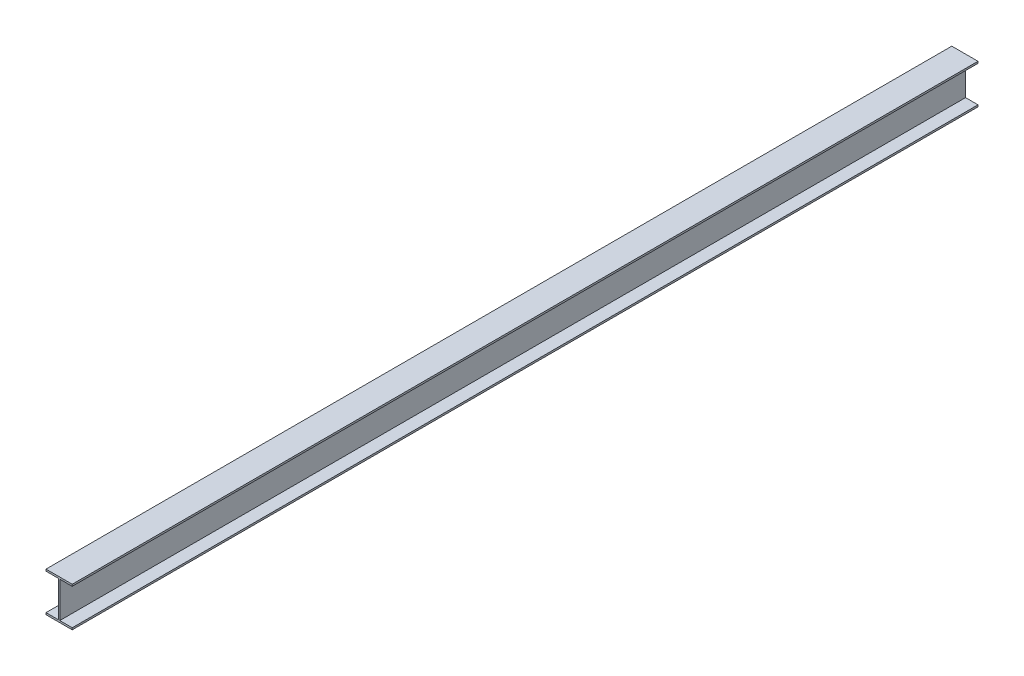
ISO-10303-21;
HEADER;
FILE_DESCRIPTION(('STEP AP214'),'2;1');
FILE_NAME('part.step','',(''),(''),'','','');
FILE_SCHEMA(('AUTOMOTIVE_DESIGN { 1 0 10303 214 1 1 1 1 }'));
ENDSEC;
DATA;
#1=APPLICATION_CONTEXT('core data for automotive mechanical design processes');
#2=APPLICATION_PROTOCOL_DEFINITION('international standard','automotive_design',2000,#1);
#3=PRODUCT_CONTEXT('',#1,'mechanical');
#4=PRODUCT('Part','Part','',(#3));
#5=PRODUCT_RELATED_PRODUCT_CATEGORY('part','',(#4));
#6=PRODUCT_DEFINITION_FORMATION('','',#4);
#7=PRODUCT_DEFINITION_CONTEXT('part definition',#1,'design');
#8=PRODUCT_DEFINITION('design','',#6,#7);
#9=PRODUCT_DEFINITION_SHAPE('','',#8);
#10=(LENGTH_UNIT() NAMED_UNIT(*) SI_UNIT(.MILLI.,.METRE.));
#11=(NAMED_UNIT(*) PLANE_ANGLE_UNIT() SI_UNIT($,.RADIAN.));
#12=(NAMED_UNIT(*) SI_UNIT($,.STERADIAN.) SOLID_ANGLE_UNIT());
#13=UNCERTAINTY_MEASURE_WITH_UNIT(LENGTH_MEASURE(1.E-05),#10,'distance_accuracy_value','');
#14=(GEOMETRIC_REPRESENTATION_CONTEXT(3) GLOBAL_UNCERTAINTY_ASSIGNED_CONTEXT((#13)) GLOBAL_UNIT_ASSIGNED_CONTEXT((#10,
#11,#12)) REPRESENTATION_CONTEXT('',''));
#15=CARTESIAN_POINT('',(0.,0.,0.));
#16=DIRECTION('',(0.,0.,1.));
#17=DIRECTION('',(1.,0.,0.));
#18=AXIS2_PLACEMENT_3D('',#15,#16,#17);
#19=CARTESIAN_POINT('',(0.,-7.11224053295814,3510.));
#20=DIRECTION('',(1.,0.,0.));
#21=DIRECTION('',(0.,0.,-1.));
#22=AXIS2_PLACEMENT_3D('',#19,#20,#21);
#23=PLANE('',#22);
#24=DIRECTION('',(0.,-1.,0.));
#25=VECTOR('',#24,1.);
#26=CARTESIAN_POINT('',(0.,-7.11224053295814,0.));
#27=LINE('',#26,#25);
#28=CARTESIAN_POINT('',(0.,-0.000240532958142959,0.));
#29=VERTEX_POINT('',#28);
#30=CARTESIAN_POINT('',(0.,-7.11224053295814,0.));
#31=VERTEX_POINT('',#30);
#32=EDGE_CURVE('E152',#29,#31,#27,.T.);
#33=ORIENTED_EDGE('',*,*,#32,.T.);
#34=DIRECTION('',(0.,0.,-1.));
#35=VECTOR('',#34,1.);
#36=CARTESIAN_POINT('',(0.,-7.11224053295814,3510.));
#37=LINE('',#36,#35);
#38=CARTESIAN_POINT('',(0.,-7.11224053295814,3510.));
#39=VERTEX_POINT('',#38);
#40=EDGE_CURVE('E11',#39,#31,#37,.T.);
#41=ORIENTED_EDGE('',*,*,#40,.F.);
#42=DIRECTION('',(0.,-1.,0.));
#43=VECTOR('',#42,1.);
#44=CARTESIAN_POINT('',(0.,-7.11224053295814,3510.));
#45=LINE('',#44,#43);
#46=CARTESIAN_POINT('',(0.,-0.000240532958142959,3510.));
#47=VERTEX_POINT('',#46);
#48=EDGE_CURVE('E174',#47,#39,#45,.T.);
#49=ORIENTED_EDGE('',*,*,#48,.F.);
#50=DIRECTION('',(0.,0.,-1.));
#51=VECTOR('',#50,1.);
#52=CARTESIAN_POINT('',(0.,-0.000240532958142959,3510.));
#53=LINE('',#52,#51);
#54=EDGE_CURVE('E148',#47,#29,#53,.T.);
#55=ORIENTED_EDGE('',*,*,#54,.T.);
#56=EDGE_LOOP('',(#33,#41,#49,#55));
#57=FACE_BOUND('',#56,.T.);
#58=ADVANCED_FACE('F32',(#57),#23,.F.);
#59=CARTESIAN_POINT('',(47.5660357142857,-7.11224053295814,3510.));
#60=DIRECTION('',(0.,1.,0.));
#61=DIRECTION('',(-1.,0.,0.));
#62=AXIS2_PLACEMENT_3D('',#59,#60,#61);
#63=PLANE('',#62);
#64=DIRECTION('',(1.,0.,0.));
#65=VECTOR('',#64,1.);
#66=CARTESIAN_POINT('',(47.5660357142857,-7.11224053295814,0.));
#67=LINE('',#66,#65);
#68=CARTESIAN_POINT('',(47.5660357142857,-7.11224053295814,0.));
#69=VERTEX_POINT('',#68);
#70=EDGE_CURVE('E155',#31,#69,#67,.T.);
#71=ORIENTED_EDGE('',*,*,#70,.T.);
#72=DIRECTION('',(0.,0.,-1.));
#73=VECTOR('',#72,1.);
#74=CARTESIAN_POINT('',(47.5660357142857,-7.11224053295814,3510.));
#75=LINE('',#74,#73);
#76=CARTESIAN_POINT('',(47.5660357142857,-7.11224053295814,3510.));
#77=VERTEX_POINT('',#76);
#78=EDGE_CURVE('E40',#77,#69,#75,.T.);
#79=ORIENTED_EDGE('',*,*,#78,.F.);
#80=DIRECTION('',(1.,0.,0.));
#81=VECTOR('',#80,1.);
#82=CARTESIAN_POINT('',(47.5660357142857,-7.11224053295814,3510.));
#83=LINE('',#82,#81);
#84=EDGE_CURVE('E103',#39,#77,#83,.T.);
#85=ORIENTED_EDGE('',*,*,#84,.F.);
#86=ORIENTED_EDGE('',*,*,#40,.T.);
#87=EDGE_LOOP('',(#71,#79,#85,#86));
#88=FACE_BOUND('',#87,.T.);
#89=ADVANCED_FACE('F252',(#88),#63,.F.);
#90=CARTESIAN_POINT('',(47.5660357142857,-146.050240532958,3510.));
#91=DIRECTION('',(1.,0.,0.));
#92=DIRECTION('',(0.,0.,-1.));
#93=AXIS2_PLACEMENT_3D('',#90,#91,#92);
#94=PLANE('',#93);
#95=DIRECTION('',(0.,-1.,0.));
#96=VECTOR('',#95,1.);
#97=CARTESIAN_POINT('',(47.5660357142857,-146.050240532958,0.));
#98=LINE('',#97,#96);
#99=CARTESIAN_POINT('',(47.5660357142857,-146.050240532958,0.));
#100=VERTEX_POINT('',#99);
#101=EDGE_CURVE('E157',#69,#100,#98,.T.);
#102=ORIENTED_EDGE('',*,*,#101,.T.);
#103=DIRECTION('',(0.,0.,-1.));
#104=VECTOR('',#103,1.);
#105=CARTESIAN_POINT('',(47.5660357142857,-146.050240532958,3510.));
#106=LINE('',#105,#104);
#107=CARTESIAN_POINT('',(47.5660357142857,-146.050240532958,3510.));
#108=VERTEX_POINT('',#107);
#109=EDGE_CURVE('E193',#108,#100,#106,.T.);
#110=ORIENTED_EDGE('',*,*,#109,.F.);
#111=DIRECTION('',(0.,-1.,0.));
#112=VECTOR('',#111,1.);
#113=CARTESIAN_POINT('',(47.5660357142857,-146.050240532958,3510.));
#114=LINE('',#113,#112);
#115=EDGE_CURVE('E201',#77,#108,#114,.T.);
#116=ORIENTED_EDGE('',*,*,#115,.F.);
#117=ORIENTED_EDGE('',*,*,#78,.T.);
#118=EDGE_LOOP('',(#102,#110,#116,#117));
#119=FACE_BOUND('',#118,.T.);
#120=ADVANCED_FACE('F199',(#119),#94,.F.);
#121=CARTESIAN_POINT('',(0.,-146.050240532958,3510.));
#122=DIRECTION('',(0.,-1.,0.));
#123=DIRECTION('',(1.,0.,0.));
#124=AXIS2_PLACEMENT_3D('',#121,#122,#123);
#125=PLANE('',#124);
#126=DIRECTION('',(-1.,0.,0.));
#127=VECTOR('',#126,1.);
#128=CARTESIAN_POINT('',(0.,-146.050240532958,0.));
#129=LINE('',#128,#127);
#130=CARTESIAN_POINT('',(0.,-146.050240532958,0.));
#131=VERTEX_POINT('',#130);
#132=EDGE_CURVE('E159',#100,#131,#129,.T.);
#133=ORIENTED_EDGE('',*,*,#132,.T.);
#134=DIRECTION('',(0.,0.,-1.));
#135=VECTOR('',#134,1.);
#136=CARTESIAN_POINT('',(0.,-146.050240532958,3510.));
#137=LINE('',#136,#135);
#138=CARTESIAN_POINT('',(0.,-146.050240532958,3510.));
#139=VERTEX_POINT('',#138);
#140=EDGE_CURVE('E190',#139,#131,#137,.T.);
#141=ORIENTED_EDGE('',*,*,#140,.F.);
#142=DIRECTION('',(-1.,0.,0.));
#143=VECTOR('',#142,1.);
#144=CARTESIAN_POINT('',(0.,-146.050240532958,3510.));
#145=LINE('',#144,#143);
#146=EDGE_CURVE('E219',#108,#139,#145,.T.);
#147=ORIENTED_EDGE('',*,*,#146,.F.);
#148=ORIENTED_EDGE('',*,*,#109,.T.);
#149=EDGE_LOOP('',(#133,#141,#147,#148));
#150=FACE_BOUND('',#149,.T.);
#151=ADVANCED_FACE('F210',(#150),#125,.F.);
#152=CARTESIAN_POINT('',(0.,-153.162240532958,3510.));
#153=DIRECTION('',(1.,0.,0.));
#154=DIRECTION('',(0.,0.,-1.));
#155=AXIS2_PLACEMENT_3D('',#152,#153,#154);
#156=PLANE('',#155);
#157=DIRECTION('',(0.,-1.,0.));
#158=VECTOR('',#157,1.);
#159=CARTESIAN_POINT('',(0.,-153.162240532958,0.));
#160=LINE('',#159,#158);
#161=CARTESIAN_POINT('',(0.,-153.162240532958,0.));
#162=VERTEX_POINT('',#161);
#163=EDGE_CURVE('E161',#131,#162,#160,.T.);
#164=ORIENTED_EDGE('',*,*,#163,.T.);
#165=DIRECTION('',(0.,0.,-1.));
#166=VECTOR('',#165,1.);
#167=CARTESIAN_POINT('',(0.,-153.162240532958,3510.));
#168=LINE('',#167,#166);
#169=CARTESIAN_POINT('',(0.,-153.162240532958,3510.));
#170=VERTEX_POINT('',#169);
#171=EDGE_CURVE('E187',#170,#162,#168,.T.);
#172=ORIENTED_EDGE('',*,*,#171,.F.);
#173=DIRECTION('',(0.,-1.,0.));
#174=VECTOR('',#173,1.);
#175=CARTESIAN_POINT('',(0.,-153.162240532958,3510.));
#176=LINE('',#175,#174);
#177=EDGE_CURVE('E216',#139,#170,#176,.T.);
#178=ORIENTED_EDGE('',*,*,#177,.F.);
#179=ORIENTED_EDGE('',*,*,#140,.T.);
#180=EDGE_LOOP('',(#164,#172,#178,#179));
#181=FACE_BOUND('',#180,.T.);
#182=ADVANCED_FACE('F214',(#181),#156,.F.);
#183=CARTESIAN_POINT('',(101.6,-153.162240532958,3510.));
#184=DIRECTION('',(0.,1.,0.));
#185=DIRECTION('',(0.,0.,1.));
#186=AXIS2_PLACEMENT_3D('',#183,#184,#185);
#187=PLANE('',#186);
#188=DIRECTION('',(1.,0.,0.));
#189=VECTOR('',#188,1.);
#190=CARTESIAN_POINT('',(101.6,-153.162240532958,0.));
#191=LINE('',#190,#189);
#192=CARTESIAN_POINT('',(101.6,-153.162240532958,0.));
#193=VERTEX_POINT('',#192);
#194=EDGE_CURVE('E163',#162,#193,#191,.T.);
#195=ORIENTED_EDGE('',*,*,#194,.T.);
#196=DIRECTION('',(0.,0.,-1.));
#197=VECTOR('',#196,1.);
#198=CARTESIAN_POINT('',(101.6,-153.162240532958,3510.));
#199=LINE('',#198,#197);
#200=CARTESIAN_POINT('',(101.6,-153.162240532958,3510.));
#201=VERTEX_POINT('',#200);
#202=EDGE_CURVE('E184',#201,#193,#199,.T.);
#203=ORIENTED_EDGE('',*,*,#202,.F.);
#204=DIRECTION('',(1.,0.,0.));
#205=VECTOR('',#204,1.);
#206=CARTESIAN_POINT('',(101.6,-153.162240532958,3510.));
#207=LINE('',#206,#205);
#208=EDGE_CURVE('E218',#170,#201,#207,.T.);
#209=ORIENTED_EDGE('',*,*,#208,.F.);
#210=ORIENTED_EDGE('',*,*,#171,.T.);
#211=EDGE_LOOP('',(#195,#203,#209,#210));
#212=FACE_BOUND('',#211,.T.);
#213=ADVANCED_FACE('F265',(#212),#187,.F.);
#214=CARTESIAN_POINT('',(101.6,-146.050240532958,3510.));
#215=DIRECTION('',(-1.,0.,0.));
#216=DIRECTION('',(0.,0.,1.));
#217=AXIS2_PLACEMENT_3D('',#214,#215,#216);
#218=PLANE('',#217);
#219=DIRECTION('',(0.,1.,0.));
#220=VECTOR('',#219,1.);
#221=CARTESIAN_POINT('',(101.6,-146.050240532958,0.));
#222=LINE('',#221,#220);
#223=CARTESIAN_POINT('',(101.6,-146.050240532958,0.));
#224=VERTEX_POINT('',#223);
#225=EDGE_CURVE('E165',#193,#224,#222,.T.);
#226=ORIENTED_EDGE('',*,*,#225,.T.);
#227=DIRECTION('',(0.,0.,-1.));
#228=VECTOR('',#227,1.);
#229=CARTESIAN_POINT('',(101.6,-146.050240532958,3510.));
#230=LINE('',#229,#228);
#231=CARTESIAN_POINT('',(101.6,-146.050240532958,3510.));
#232=VERTEX_POINT('',#231);
#233=EDGE_CURVE('E181',#232,#224,#230,.T.);
#234=ORIENTED_EDGE('',*,*,#233,.F.);
#235=DIRECTION('',(0.,1.,0.));
#236=VECTOR('',#235,1.);
#237=CARTESIAN_POINT('',(101.6,-146.050240532958,3510.));
#238=LINE('',#237,#236);
#239=EDGE_CURVE('E221',#201,#232,#238,.T.);
#240=ORIENTED_EDGE('',*,*,#239,.F.);
#241=ORIENTED_EDGE('',*,*,#202,.T.);
#242=EDGE_LOOP('',(#226,#234,#240,#241));
#243=FACE_BOUND('',#242,.T.);
#244=ADVANCED_FACE('F268',(#243),#218,.F.);
#245=CARTESIAN_POINT('',(53.4080357142857,-146.050240532958,3510.));
#246=DIRECTION('',(0.,-1.,0.));
#247=DIRECTION('',(1.,0.,0.));
#248=AXIS2_PLACEMENT_3D('',#245,#246,#247);
#249=PLANE('',#248);
#250=DIRECTION('',(-1.,0.,0.));
#251=VECTOR('',#250,1.);
#252=CARTESIAN_POINT('',(53.4080357142857,-146.050240532958,0.));
#253=LINE('',#252,#251);
#254=CARTESIAN_POINT('',(53.4080357142857,-146.050240532958,0.));
#255=VERTEX_POINT('',#254);
#256=EDGE_CURVE('E167',#224,#255,#253,.T.);
#257=ORIENTED_EDGE('',*,*,#256,.T.);
#258=DIRECTION('',(0.,0.,-1.));
#259=VECTOR('',#258,1.);
#260=CARTESIAN_POINT('',(53.4080357142857,-146.050240532958,3510.));
#261=LINE('',#260,#259);
#262=CARTESIAN_POINT('',(53.4080357142857,-146.050240532958,3510.));
#263=VERTEX_POINT('',#262);
#264=EDGE_CURVE('E178',#263,#255,#261,.T.);
#265=ORIENTED_EDGE('',*,*,#264,.F.);
#266=DIRECTION('',(-1.,0.,0.));
#267=VECTOR('',#266,1.);
#268=CARTESIAN_POINT('',(53.4080357142857,-146.050240532958,3510.));
#269=LINE('',#268,#267);
#270=EDGE_CURVE('E227',#232,#263,#269,.T.);
#271=ORIENTED_EDGE('',*,*,#270,.F.);
#272=ORIENTED_EDGE('',*,*,#233,.T.);
#273=EDGE_LOOP('',(#257,#265,#271,#272));
#274=FACE_BOUND('',#273,.T.);
#275=ADVANCED_FACE('F233',(#274),#249,.F.);
#276=CARTESIAN_POINT('',(53.4080357142857,-7.11224053295815,3510.));
#277=DIRECTION('',(-1.,0.,0.));
#278=DIRECTION('',(0.,-1.,0.));
#279=AXIS2_PLACEMENT_3D('',#276,#277,#278);
#280=PLANE('',#279);
#281=DIRECTION('',(0.,1.,0.));
#282=VECTOR('',#281,1.);
#283=CARTESIAN_POINT('',(53.4080357142857,-7.11224053295815,0.));
#284=LINE('',#283,#282);
#285=CARTESIAN_POINT('',(53.4080357142857,-7.11224053295815,0.));
#286=VERTEX_POINT('',#285);
#287=EDGE_CURVE('E169',#255,#286,#284,.T.);
#288=ORIENTED_EDGE('',*,*,#287,.T.);
#289=DIRECTION('',(0.,0.,-1.));
#290=VECTOR('',#289,1.);
#291=CARTESIAN_POINT('',(53.4080357142857,-7.11224053295815,3510.));
#292=LINE('',#291,#290);
#293=CARTESIAN_POINT('',(53.4080357142857,-7.11224053295815,3510.));
#294=VERTEX_POINT('',#293);
#295=EDGE_CURVE('E143',#294,#286,#292,.T.);
#296=ORIENTED_EDGE('',*,*,#295,.F.);
#297=DIRECTION('',(0.,1.,0.));
#298=VECTOR('',#297,1.);
#299=CARTESIAN_POINT('',(53.4080357142857,-7.11224053295815,3510.));
#300=LINE('',#299,#298);
#301=EDGE_CURVE('E134',#263,#294,#300,.T.);
#302=ORIENTED_EDGE('',*,*,#301,.F.);
#303=ORIENTED_EDGE('',*,*,#264,.T.);
#304=EDGE_LOOP('',(#288,#296,#302,#303));
#305=FACE_BOUND('',#304,.T.);
#306=ADVANCED_FACE('F237',(#305),#280,.F.);
#307=CARTESIAN_POINT('',(101.6,-7.11224053295814,3510.));
#308=DIRECTION('',(0.,1.,0.));
#309=DIRECTION('',(-1.,0.,0.));
#310=AXIS2_PLACEMENT_3D('',#307,#308,#309);
#311=PLANE('',#310);
#312=DIRECTION('',(1.,0.,0.));
#313=VECTOR('',#312,1.);
#314=CARTESIAN_POINT('',(101.6,-7.11224053295814,0.));
#315=LINE('',#314,#313);
#316=CARTESIAN_POINT('',(101.6,-7.11224053295814,0.));
#317=VERTEX_POINT('',#316);
#318=EDGE_CURVE('E142',#286,#317,#315,.T.);
#319=ORIENTED_EDGE('',*,*,#318,.T.);
#320=DIRECTION('',(0.,0.,-1.));
#321=VECTOR('',#320,1.);
#322=CARTESIAN_POINT('',(101.6,-7.11224053295814,3510.));
#323=LINE('',#322,#321);
#324=CARTESIAN_POINT('',(101.6,-7.11224053295814,3510.));
#325=VERTEX_POINT('',#324);
#326=EDGE_CURVE('E139',#325,#317,#323,.T.);
#327=ORIENTED_EDGE('',*,*,#326,.F.);
#328=DIRECTION('',(1.,0.,0.));
#329=VECTOR('',#328,1.);
#330=CARTESIAN_POINT('',(101.6,-7.11224053295814,3510.));
#331=LINE('',#330,#329);
#332=EDGE_CURVE('E128',#294,#325,#331,.T.);
#333=ORIENTED_EDGE('',*,*,#332,.F.);
#334=ORIENTED_EDGE('',*,*,#295,.T.);
#335=EDGE_LOOP('',(#319,#327,#333,#334));
#336=FACE_BOUND('',#335,.T.);
#337=ADVANCED_FACE('F140',(#336),#311,.F.);
#338=CARTESIAN_POINT('',(101.6,-0.000240532958130516,3510.));
#339=DIRECTION('',(-1.,0.,0.));
#340=DIRECTION('',(0.,0.,1.));
#341=AXIS2_PLACEMENT_3D('',#338,#339,#340);
#342=PLANE('',#341);
#343=DIRECTION('',(0.,1.,0.));
#344=VECTOR('',#343,1.);
#345=CARTESIAN_POINT('',(101.6,-0.000240532958130516,0.));
#346=LINE('',#345,#344);
#347=CARTESIAN_POINT('',(101.6,-0.000240532958130516,0.));
#348=VERTEX_POINT('',#347);
#349=EDGE_CURVE('E89',#317,#348,#346,.T.);
#350=ORIENTED_EDGE('',*,*,#349,.T.);
#351=DIRECTION('',(0.,0.,-1.));
#352=VECTOR('',#351,1.);
#353=CARTESIAN_POINT('',(101.6,-0.000240532958130516,3510.));
#354=LINE('',#353,#352);
#355=CARTESIAN_POINT('',(101.6,-0.000240532958130516,3510.));
#356=VERTEX_POINT('',#355);
#357=EDGE_CURVE('E144',#356,#348,#354,.T.);
#358=ORIENTED_EDGE('',*,*,#357,.F.);
#359=DIRECTION('',(0.,1.,0.));
#360=VECTOR('',#359,1.);
#361=CARTESIAN_POINT('',(101.6,-0.000240532958130516,3510.));
#362=LINE('',#361,#360);
#363=EDGE_CURVE('E132',#325,#356,#362,.T.);
#364=ORIENTED_EDGE('',*,*,#363,.F.);
#365=ORIENTED_EDGE('',*,*,#326,.T.);
#366=EDGE_LOOP('',(#350,#358,#364,#365));
#367=FACE_BOUND('',#366,.T.);
#368=ADVANCED_FACE('F146',(#367),#342,.F.);
#369=CARTESIAN_POINT('',(0.,-0.000240532958142959,3510.));
#370=DIRECTION('',(0.,-1.,0.));
#371=DIRECTION('',(1.,0.,0.));
#372=AXIS2_PLACEMENT_3D('',#369,#370,#371);
#373=PLANE('',#372);
#374=DIRECTION('',(-1.,0.,0.));
#375=VECTOR('',#374,1.);
#376=CARTESIAN_POINT('',(0.,-0.000240532958142959,0.));
#377=LINE('',#376,#375);
#378=EDGE_CURVE('E95',#348,#29,#377,.T.);
#379=ORIENTED_EDGE('',*,*,#378,.T.);
#380=ORIENTED_EDGE('',*,*,#54,.F.);
#381=DIRECTION('',(-1.,0.,0.));
#382=VECTOR('',#381,1.);
#383=CARTESIAN_POINT('',(0.,-0.000240532958142959,3510.));
#384=LINE('',#383,#382);
#385=EDGE_CURVE('E48',#356,#47,#384,.T.);
#386=ORIENTED_EDGE('',*,*,#385,.F.);
#387=ORIENTED_EDGE('',*,*,#357,.T.);
#388=EDGE_LOOP('',(#379,#380,#386,#387));
#389=FACE_BOUND('',#388,.T.);
#390=ADVANCED_FACE('F241',(#389),#373,.F.);
#391=CARTESIAN_POINT('',(0.,0.,3510.));
#392=DIRECTION('',(0.,0.,-1.));
#393=DIRECTION('',(-1.,0.,0.));
#394=AXIS2_PLACEMENT_3D('',#391,#392,#393);
#395=PLANE('',#394);
#396=ORIENTED_EDGE('',*,*,#48,.T.);
#397=ORIENTED_EDGE('',*,*,#84,.T.);
#398=ORIENTED_EDGE('',*,*,#115,.T.);
#399=ORIENTED_EDGE('',*,*,#146,.T.);
#400=ORIENTED_EDGE('',*,*,#177,.T.);
#401=ORIENTED_EDGE('',*,*,#208,.T.);
#402=ORIENTED_EDGE('',*,*,#239,.T.);
#403=ORIENTED_EDGE('',*,*,#270,.T.);
#404=ORIENTED_EDGE('',*,*,#301,.T.);
#405=ORIENTED_EDGE('',*,*,#332,.T.);
#406=ORIENTED_EDGE('',*,*,#363,.T.);
#407=ORIENTED_EDGE('',*,*,#385,.T.);
#408=EDGE_LOOP('',(#396,#397,#398,#399,#400,#401,#402,#403,#404,#405,#406,#407));
#409=FACE_BOUND('',#408,.T.);
#410=ADVANCED_FACE('F130',(#409),#395,.F.);
#411=CARTESIAN_POINT('',(0.,0.,0.));
#412=DIRECTION('',(0.,0.,-1.));
#413=DIRECTION('',(-1.,0.,0.));
#414=AXIS2_PLACEMENT_3D('',#411,#412,#413);
#415=PLANE('',#414);
#416=ORIENTED_EDGE('',*,*,#32,.F.);
#417=ORIENTED_EDGE('',*,*,#378,.F.);
#418=ORIENTED_EDGE('',*,*,#349,.F.);
#419=ORIENTED_EDGE('',*,*,#318,.F.);
#420=ORIENTED_EDGE('',*,*,#287,.F.);
#421=ORIENTED_EDGE('',*,*,#256,.F.);
#422=ORIENTED_EDGE('',*,*,#225,.F.);
#423=ORIENTED_EDGE('',*,*,#194,.F.);
#424=ORIENTED_EDGE('',*,*,#163,.F.);
#425=ORIENTED_EDGE('',*,*,#132,.F.);
#426=ORIENTED_EDGE('',*,*,#101,.F.);
#427=ORIENTED_EDGE('',*,*,#70,.F.);
#428=EDGE_LOOP('',(#416,#417,#418,#419,#420,#421,#422,#423,#424,#425,#426,#427));
#429=FACE_BOUND('',#428,.T.);
#430=ADVANCED_FACE('F205',(#429),#415,.T.);
#431=CLOSED_SHELL('',(#58,#89,#120,#151,#182,#213,#244,#275,#306,#337,#368,#390,#410,#430));
#432=MANIFOLD_SOLID_BREP('B2',#431);
#433=ADVANCED_BREP_SHAPE_REPRESENTATION('',(#18,#432),#14);
#434=SHAPE_DEFINITION_REPRESENTATION(#9,#433);
ENDSEC;
END-ISO-10303-21;
